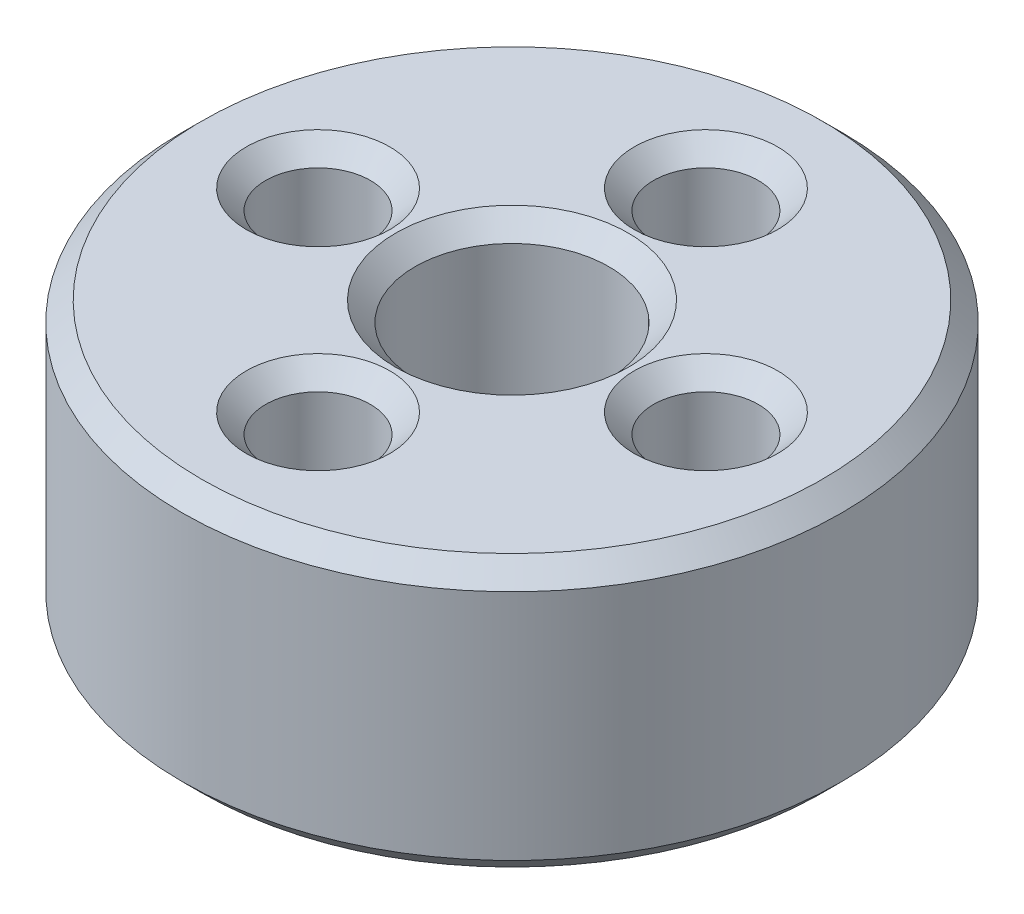
ISO-10303-21;
HEADER;
FILE_DESCRIPTION(('STEP AP214'),'2;1');
FILE_NAME('part.step','',(''),(''),'','','');
FILE_SCHEMA(('AUTOMOTIVE_DESIGN { 1 0 10303 214 1 1 1 1 }'));
ENDSEC;
DATA;
#1=APPLICATION_CONTEXT('core data for automotive mechanical design processes');
#2=APPLICATION_PROTOCOL_DEFINITION('international standard','automotive_design',2000,#1);
#3=PRODUCT_CONTEXT('',#1,'mechanical');
#4=PRODUCT('Part','Part','',(#3));
#5=PRODUCT_RELATED_PRODUCT_CATEGORY('part','',(#4));
#6=PRODUCT_DEFINITION_FORMATION('','',#4);
#7=PRODUCT_DEFINITION_CONTEXT('part definition',#1,'design');
#8=PRODUCT_DEFINITION('design','',#6,#7);
#9=PRODUCT_DEFINITION_SHAPE('','',#8);
#10=(LENGTH_UNIT() NAMED_UNIT(*) SI_UNIT(.MILLI.,.METRE.));
#11=(NAMED_UNIT(*) PLANE_ANGLE_UNIT() SI_UNIT($,.RADIAN.));
#12=(NAMED_UNIT(*) SI_UNIT($,.STERADIAN.) SOLID_ANGLE_UNIT());
#13=UNCERTAINTY_MEASURE_WITH_UNIT(LENGTH_MEASURE(1.E-05),#10,'distance_accuracy_value','');
#14=(GEOMETRIC_REPRESENTATION_CONTEXT(3) GLOBAL_UNCERTAINTY_ASSIGNED_CONTEXT((#13)) GLOBAL_UNIT_ASSIGNED_CONTEXT((#10,
#11,#12)) REPRESENTATION_CONTEXT('',''));
#15=CARTESIAN_POINT('',(0.,0.,0.));
#16=DIRECTION('',(0.,0.,1.));
#17=DIRECTION('',(1.,0.,0.));
#18=AXIS2_PLACEMENT_3D('',#15,#16,#17);
#19=CARTESIAN_POINT('',(0.,7.,0.));
#20=DIRECTION('',(0.,1.,0.));
#21=DIRECTION('',(0.,0.,1.));
#22=AXIS2_PLACEMENT_3D('',#19,#20,#21);
#23=PLANE('',#22);
#24=CARTESIAN_POINT('',(0.,7.,5.));
#25=DIRECTION('',(0.,1.,0.));
#26=DIRECTION('',(0.,0.,1.));
#27=AXIS2_PLACEMENT_3D('',#24,#25,#26);
#28=CIRCLE('',#27,1.85);
#29=CARTESIAN_POINT('',(0.,7.,6.85));
#30=VERTEX_POINT('',#29);
#31=EDGE_CURVE('E10',#30,#30,#28,.F.);
#32=ORIENTED_EDGE('',*,*,#31,.T.);
#33=EDGE_LOOP('',(#32));
#34=FACE_BOUND('',#33,.T.);
#35=CARTESIAN_POINT('',(0.,7.,-5.));
#36=DIRECTION('',(0.,1.,0.));
#37=DIRECTION('',(0.,0.,1.));
#38=AXIS2_PLACEMENT_3D('',#35,#36,#37);
#39=CIRCLE('',#38,1.85);
#40=CARTESIAN_POINT('',(0.,7.,-3.15000000000001));
#41=VERTEX_POINT('',#40);
#42=EDGE_CURVE('E43',#41,#41,#39,.F.);
#43=ORIENTED_EDGE('',*,*,#42,.T.);
#44=EDGE_LOOP('',(#43));
#45=FACE_BOUND('',#44,.T.);
#46=CARTESIAN_POINT('',(-5.,7.,0.));
#47=DIRECTION('',(0.,1.,0.));
#48=DIRECTION('',(0.,0.,1.));
#49=AXIS2_PLACEMENT_3D('',#46,#47,#48);
#50=CIRCLE('',#49,1.85);
#51=CARTESIAN_POINT('',(-5.,7.,1.85));
#52=VERTEX_POINT('',#51);
#53=EDGE_CURVE('E47',#52,#52,#50,.F.);
#54=ORIENTED_EDGE('',*,*,#53,.T.);
#55=EDGE_LOOP('',(#54));
#56=FACE_BOUND('',#55,.T.);
#57=CARTESIAN_POINT('',(0.,7.,0.));
#58=DIRECTION('',(0.,1.,0.));
#59=DIRECTION('',(0.,0.,1.));
#60=AXIS2_PLACEMENT_3D('',#57,#58,#59);
#61=CIRCLE('',#60,7.99999999999999);
#62=CARTESIAN_POINT('',(0.,7.,7.99999999999999));
#63=VERTEX_POINT('',#62);
#64=EDGE_CURVE('E51',#63,#63,#61,.T.);
#65=ORIENTED_EDGE('',*,*,#64,.T.);
#66=EDGE_LOOP('',(#65));
#67=FACE_BOUND('',#66,.T.);
#68=CARTESIAN_POINT('',(0.,7.,0.));
#69=DIRECTION('',(0.,1.,0.));
#70=DIRECTION('',(0.,0.,1.));
#71=AXIS2_PLACEMENT_3D('',#68,#69,#70);
#72=CIRCLE('',#71,3.);
#73=CARTESIAN_POINT('',(0.,7.,3.00000000000001));
#74=VERTEX_POINT('',#73);
#75=EDGE_CURVE('E56',#74,#74,#72,.F.);
#76=ORIENTED_EDGE('',*,*,#75,.T.);
#77=EDGE_LOOP('',(#76));
#78=FACE_BOUND('',#77,.T.);
#79=CARTESIAN_POINT('',(5.,7.,0.));
#80=DIRECTION('',(0.,1.,0.));
#81=DIRECTION('',(0.,0.,1.));
#82=AXIS2_PLACEMENT_3D('',#79,#80,#81);
#83=CIRCLE('',#82,1.85);
#84=CARTESIAN_POINT('',(5.,7.,1.85));
#85=VERTEX_POINT('',#84);
#86=EDGE_CURVE('E59',#85,#85,#83,.F.);
#87=ORIENTED_EDGE('',*,*,#86,.T.);
#88=EDGE_LOOP('',(#87));
#89=FACE_BOUND('',#88,.T.);
#90=ADVANCED_FACE('F35',(#34,#45,#56,#67,#78,#89),#23,.T.);
#91=CARTESIAN_POINT('',(0.,0.,0.));
#92=DIRECTION('',(0.,1.,0.));
#93=DIRECTION('',(0.,0.,1.));
#94=AXIS2_PLACEMENT_3D('',#91,#92,#93);
#95=PLANE('',#94);
#96=CARTESIAN_POINT('',(0.,0.,5.));
#97=DIRECTION('',(0.,1.,0.));
#98=DIRECTION('',(0.,0.,1.));
#99=AXIS2_PLACEMENT_3D('',#96,#97,#98);
#100=CIRCLE('',#99,1.85);
#101=CARTESIAN_POINT('',(0.,0.,6.85));
#102=VERTEX_POINT('',#101);
#103=EDGE_CURVE('E98',#102,#102,#100,.T.);
#104=ORIENTED_EDGE('',*,*,#103,.T.);
#105=EDGE_LOOP('',(#104));
#106=FACE_BOUND('',#105,.T.);
#107=CARTESIAN_POINT('',(5.,0.,0.));
#108=DIRECTION('',(0.,1.,0.));
#109=DIRECTION('',(0.,0.,1.));
#110=AXIS2_PLACEMENT_3D('',#107,#108,#109);
#111=CIRCLE('',#110,1.85);
#112=CARTESIAN_POINT('',(5.,0.,1.85));
#113=VERTEX_POINT('',#112);
#114=EDGE_CURVE('E101',#113,#113,#111,.T.);
#115=ORIENTED_EDGE('',*,*,#114,.T.);
#116=EDGE_LOOP('',(#115));
#117=FACE_BOUND('',#116,.T.);
#118=CARTESIAN_POINT('',(0.,0.,-5.));
#119=DIRECTION('',(0.,1.,0.));
#120=DIRECTION('',(0.,0.,1.));
#121=AXIS2_PLACEMENT_3D('',#118,#119,#120);
#122=CIRCLE('',#121,1.85);
#123=CARTESIAN_POINT('',(0.,0.,-3.15000000000001));
#124=VERTEX_POINT('',#123);
#125=EDGE_CURVE('E104',#124,#124,#122,.T.);
#126=ORIENTED_EDGE('',*,*,#125,.T.);
#127=EDGE_LOOP('',(#126));
#128=FACE_BOUND('',#127,.T.);
#129=CARTESIAN_POINT('',(0.,0.,0.));
#130=DIRECTION('',(0.,1.,0.));
#131=DIRECTION('',(0.,0.,1.));
#132=AXIS2_PLACEMENT_3D('',#129,#130,#131);
#133=CIRCLE('',#132,3.);
#134=CARTESIAN_POINT('',(0.,0.,3.00000000000001));
#135=VERTEX_POINT('',#134);
#136=EDGE_CURVE('E107',#135,#135,#133,.T.);
#137=ORIENTED_EDGE('',*,*,#136,.T.);
#138=EDGE_LOOP('',(#137));
#139=FACE_BOUND('',#138,.T.);
#140=CARTESIAN_POINT('',(-5.,0.,0.));
#141=DIRECTION('',(0.,1.,0.));
#142=DIRECTION('',(0.,0.,1.));
#143=AXIS2_PLACEMENT_3D('',#140,#141,#142);
#144=CIRCLE('',#143,1.85);
#145=CARTESIAN_POINT('',(-5.,0.,1.85));
#146=VERTEX_POINT('',#145);
#147=EDGE_CURVE('E110',#146,#146,#144,.T.);
#148=ORIENTED_EDGE('',*,*,#147,.T.);
#149=EDGE_LOOP('',(#148));
#150=FACE_BOUND('',#149,.T.);
#151=CARTESIAN_POINT('',(0.,0.,0.));
#152=DIRECTION('',(0.,1.,0.));
#153=DIRECTION('',(0.,0.,1.));
#154=AXIS2_PLACEMENT_3D('',#151,#152,#153);
#155=CIRCLE('',#154,8.);
#156=CARTESIAN_POINT('',(0.,0.,8.));
#157=VERTEX_POINT('',#156);
#158=EDGE_CURVE('E113',#157,#157,#155,.F.);
#159=ORIENTED_EDGE('',*,*,#158,.T.);
#160=EDGE_LOOP('',(#159));
#161=FACE_BOUND('',#160,.T.);
#162=ADVANCED_FACE('F117',(#106,#117,#128,#139,#150,#161),#95,.F.);
#163=CARTESIAN_POINT('',(0.,7.,0.));
#164=DIRECTION('',(0.,-1.,0.));
#165=DIRECTION('',(0.,0.,-1.));
#166=AXIS2_PLACEMENT_3D('',#163,#164,#165);
#167=CYLINDRICAL_SURFACE('',#166,8.5);
#168=CARTESIAN_POINT('',(0.,0.500000000000002,0.));
#169=DIRECTION('',(0.,1.,0.));
#170=DIRECTION('',(0.,0.,1.));
#171=AXIS2_PLACEMENT_3D('',#168,#169,#170);
#172=CIRCLE('',#171,8.5);
#173=CARTESIAN_POINT('',(0.,0.500000000000002,8.5));
#174=VERTEX_POINT('',#173);
#175=EDGE_CURVE('E62',#174,#174,#172,.T.);
#176=ORIENTED_EDGE('',*,*,#175,.T.);
#177=EDGE_LOOP('',(#176));
#178=FACE_BOUND('',#177,.T.);
#179=CARTESIAN_POINT('',(0.,6.49999999999999,0.));
#180=DIRECTION('',(0.,1.,0.));
#181=DIRECTION('',(0.,0.,1.));
#182=AXIS2_PLACEMENT_3D('',#179,#180,#181);
#183=CIRCLE('',#182,8.5);
#184=CARTESIAN_POINT('',(0.,6.49999999999999,8.5));
#185=VERTEX_POINT('',#184);
#186=EDGE_CURVE('E65',#185,#185,#183,.F.);
#187=ORIENTED_EDGE('',*,*,#186,.T.);
#188=EDGE_LOOP('',(#187));
#189=FACE_BOUND('',#188,.T.);
#190=ADVANCED_FACE('F127',(#178,#189),#167,.T.);
#191=CARTESIAN_POINT('',(-5.,7.,0.));
#192=DIRECTION('',(0.,-1.,0.));
#193=DIRECTION('',(0.,0.,-1.));
#194=AXIS2_PLACEMENT_3D('',#191,#192,#193);
#195=CYLINDRICAL_SURFACE('',#194,1.35);
#196=CARTESIAN_POINT('',(-5.,0.500000000000006,0.));
#197=DIRECTION('',(0.,1.,0.));
#198=DIRECTION('',(0.,0.,1.));
#199=AXIS2_PLACEMENT_3D('',#196,#197,#198);
#200=CIRCLE('',#199,1.35);
#201=CARTESIAN_POINT('',(-5.,0.500000000000006,1.35));
#202=VERTEX_POINT('',#201);
#203=EDGE_CURVE('E68',#202,#202,#200,.F.);
#204=ORIENTED_EDGE('',*,*,#203,.T.);
#205=EDGE_LOOP('',(#204));
#206=FACE_BOUND('',#205,.T.);
#207=CARTESIAN_POINT('',(-5.,6.5,0.));
#208=DIRECTION('',(0.,1.,0.));
#209=DIRECTION('',(0.,0.,1.));
#210=AXIS2_PLACEMENT_3D('',#207,#208,#209);
#211=CIRCLE('',#210,1.35);
#212=CARTESIAN_POINT('',(-5.,6.5,1.35));
#213=VERTEX_POINT('',#212);
#214=EDGE_CURVE('E71',#213,#213,#211,.T.);
#215=ORIENTED_EDGE('',*,*,#214,.T.);
#216=EDGE_LOOP('',(#215));
#217=FACE_BOUND('',#216,.T.);
#218=ADVANCED_FACE('F130',(#206,#217),#195,.F.);
#219=CARTESIAN_POINT('',(0.,7.,0.));
#220=DIRECTION('',(0.,-1.,0.));
#221=DIRECTION('',(0.,0.,-1.));
#222=AXIS2_PLACEMENT_3D('',#219,#220,#221);
#223=CYLINDRICAL_SURFACE('',#222,2.5);
#224=CARTESIAN_POINT('',(0.,0.500000000000001,0.));
#225=DIRECTION('',(0.,1.,0.));
#226=DIRECTION('',(0.,0.,1.));
#227=AXIS2_PLACEMENT_3D('',#224,#225,#226);
#228=CIRCLE('',#227,2.5);
#229=CARTESIAN_POINT('',(0.,0.500000000000001,2.50000000000001));
#230=VERTEX_POINT('',#229);
#231=EDGE_CURVE('E74',#230,#230,#228,.F.);
#232=ORIENTED_EDGE('',*,*,#231,.T.);
#233=EDGE_LOOP('',(#232));
#234=FACE_BOUND('',#233,.T.);
#235=CARTESIAN_POINT('',(0.,6.5,0.));
#236=DIRECTION('',(0.,1.,0.));
#237=DIRECTION('',(0.,0.,1.));
#238=AXIS2_PLACEMENT_3D('',#235,#236,#237);
#239=CIRCLE('',#238,2.5);
#240=CARTESIAN_POINT('',(0.,6.5,2.50000000000001));
#241=VERTEX_POINT('',#240);
#242=EDGE_CURVE('E77',#241,#241,#239,.T.);
#243=ORIENTED_EDGE('',*,*,#242,.T.);
#244=EDGE_LOOP('',(#243));
#245=FACE_BOUND('',#244,.T.);
#246=ADVANCED_FACE('F166',(#234,#245),#223,.F.);
#247=CARTESIAN_POINT('',(0.,7.,-5.));
#248=DIRECTION('',(0.,-1.,0.));
#249=DIRECTION('',(0.,0.,-1.));
#250=AXIS2_PLACEMENT_3D('',#247,#248,#249);
#251=CYLINDRICAL_SURFACE('',#250,1.35);
#252=CARTESIAN_POINT('',(0.,0.500000000000004,-5.));
#253=DIRECTION('',(0.,1.,0.));
#254=DIRECTION('',(0.,0.,1.));
#255=AXIS2_PLACEMENT_3D('',#252,#253,#254);
#256=CIRCLE('',#255,1.35);
#257=CARTESIAN_POINT('',(0.,0.500000000000004,-3.65000000000001));
#258=VERTEX_POINT('',#257);
#259=EDGE_CURVE('E80',#258,#258,#256,.F.);
#260=ORIENTED_EDGE('',*,*,#259,.T.);
#261=EDGE_LOOP('',(#260));
#262=FACE_BOUND('',#261,.T.);
#263=CARTESIAN_POINT('',(0.,6.5,-5.));
#264=DIRECTION('',(0.,1.,0.));
#265=DIRECTION('',(0.,0.,1.));
#266=AXIS2_PLACEMENT_3D('',#263,#264,#265);
#267=CIRCLE('',#266,1.35);
#268=CARTESIAN_POINT('',(0.,6.5,-3.65000000000001));
#269=VERTEX_POINT('',#268);
#270=EDGE_CURVE('E83',#269,#269,#267,.T.);
#271=ORIENTED_EDGE('',*,*,#270,.T.);
#272=EDGE_LOOP('',(#271));
#273=FACE_BOUND('',#272,.T.);
#274=ADVANCED_FACE('F156',(#262,#273),#251,.F.);
#275=CARTESIAN_POINT('',(5.,7.,0.));
#276=DIRECTION('',(0.,-1.,0.));
#277=DIRECTION('',(0.,0.,-1.));
#278=AXIS2_PLACEMENT_3D('',#275,#276,#277);
#279=CYLINDRICAL_SURFACE('',#278,1.35);
#280=CARTESIAN_POINT('',(5.,0.5,0.));
#281=DIRECTION('',(0.,1.,0.));
#282=DIRECTION('',(0.,0.,1.));
#283=AXIS2_PLACEMENT_3D('',#280,#281,#282);
#284=CIRCLE('',#283,1.35);
#285=CARTESIAN_POINT('',(5.,0.5,1.35));
#286=VERTEX_POINT('',#285);
#287=EDGE_CURVE('E86',#286,#286,#284,.F.);
#288=ORIENTED_EDGE('',*,*,#287,.T.);
#289=EDGE_LOOP('',(#288));
#290=FACE_BOUND('',#289,.T.);
#291=CARTESIAN_POINT('',(5.,6.5,0.));
#292=DIRECTION('',(0.,1.,0.));
#293=DIRECTION('',(0.,0.,1.));
#294=AXIS2_PLACEMENT_3D('',#291,#292,#293);
#295=CIRCLE('',#294,1.35);
#296=CARTESIAN_POINT('',(5.,6.5,1.35));
#297=VERTEX_POINT('',#296);
#298=EDGE_CURVE('E89',#297,#297,#295,.T.);
#299=ORIENTED_EDGE('',*,*,#298,.T.);
#300=EDGE_LOOP('',(#299));
#301=FACE_BOUND('',#300,.T.);
#302=ADVANCED_FACE('F153',(#290,#301),#279,.F.);
#303=CARTESIAN_POINT('',(0.,7.,5.));
#304=DIRECTION('',(0.,-1.,0.));
#305=DIRECTION('',(0.,0.,-1.));
#306=AXIS2_PLACEMENT_3D('',#303,#304,#305);
#307=CYLINDRICAL_SURFACE('',#306,1.35);
#308=CARTESIAN_POINT('',(0.,0.500000000000006,5.));
#309=DIRECTION('',(0.,1.,0.));
#310=DIRECTION('',(0.,0.,1.));
#311=AXIS2_PLACEMENT_3D('',#308,#309,#310);
#312=CIRCLE('',#311,1.35);
#313=CARTESIAN_POINT('',(0.,0.500000000000006,6.35));
#314=VERTEX_POINT('',#313);
#315=EDGE_CURVE('E92',#314,#314,#312,.F.);
#316=ORIENTED_EDGE('',*,*,#315,.T.);
#317=EDGE_LOOP('',(#316));
#318=FACE_BOUND('',#317,.T.);
#319=CARTESIAN_POINT('',(0.,6.5,5.));
#320=DIRECTION('',(0.,1.,0.));
#321=DIRECTION('',(0.,0.,1.));
#322=AXIS2_PLACEMENT_3D('',#319,#320,#321);
#323=CIRCLE('',#322,1.35);
#324=CARTESIAN_POINT('',(0.,6.5,6.35));
#325=VERTEX_POINT('',#324);
#326=EDGE_CURVE('E95',#325,#325,#323,.T.);
#327=ORIENTED_EDGE('',*,*,#326,.T.);
#328=EDGE_LOOP('',(#327));
#329=FACE_BOUND('',#328,.T.);
#330=ADVANCED_FACE('F155',(#318,#329),#307,.F.);
#331=CARTESIAN_POINT('',(0.,0.,5.));
#332=DIRECTION('',(0.,-1.,0.));
#333=DIRECTION('',(0.,0.,-1.));
#334=AXIS2_PLACEMENT_3D('',#331,#332,#333);
#335=CONICAL_SURFACE('',#334,1.85,0.785398163397446);
#336=ORIENTED_EDGE('',*,*,#315,.F.);
#337=EDGE_LOOP('',(#336));
#338=FACE_BOUND('',#337,.T.);
#339=ORIENTED_EDGE('',*,*,#103,.F.);
#340=EDGE_LOOP('',(#339));
#341=FACE_BOUND('',#340,.T.);
#342=ADVANCED_FACE('F163',(#338,#341),#335,.F.);
#343=CARTESIAN_POINT('',(5.,0.,0.));
#344=DIRECTION('',(0.,-1.,0.));
#345=DIRECTION('',(0.,0.,-1.));
#346=AXIS2_PLACEMENT_3D('',#343,#344,#345);
#347=CONICAL_SURFACE('',#346,1.85,0.785398163397446);
#348=ORIENTED_EDGE('',*,*,#287,.F.);
#349=EDGE_LOOP('',(#348));
#350=FACE_BOUND('',#349,.T.);
#351=ORIENTED_EDGE('',*,*,#114,.F.);
#352=EDGE_LOOP('',(#351));
#353=FACE_BOUND('',#352,.T.);
#354=ADVANCED_FACE('F185',(#350,#353),#347,.F.);
#355=CARTESIAN_POINT('',(0.,0.,-5.));
#356=DIRECTION('',(0.,-1.,0.));
#357=DIRECTION('',(0.,0.,-1.));
#358=AXIS2_PLACEMENT_3D('',#355,#356,#357);
#359=CONICAL_SURFACE('',#358,1.85,0.785398163397446);
#360=ORIENTED_EDGE('',*,*,#259,.F.);
#361=EDGE_LOOP('',(#360));
#362=FACE_BOUND('',#361,.T.);
#363=ORIENTED_EDGE('',*,*,#125,.F.);
#364=EDGE_LOOP('',(#363));
#365=FACE_BOUND('',#364,.T.);
#366=ADVANCED_FACE('F192',(#362,#365),#359,.F.);
#367=CARTESIAN_POINT('',(0.,0.,0.));
#368=DIRECTION('',(0.,-1.,0.));
#369=DIRECTION('',(0.,0.,-1.));
#370=AXIS2_PLACEMENT_3D('',#367,#368,#369);
#371=CONICAL_SURFACE('',#370,3.,0.785398163397447);
#372=ORIENTED_EDGE('',*,*,#231,.F.);
#373=EDGE_LOOP('',(#372));
#374=FACE_BOUND('',#373,.T.);
#375=ORIENTED_EDGE('',*,*,#136,.F.);
#376=EDGE_LOOP('',(#375));
#377=FACE_BOUND('',#376,.T.);
#378=ADVANCED_FACE('F199',(#374,#377),#371,.F.);
#379=CARTESIAN_POINT('',(-5.,0.,0.));
#380=DIRECTION('',(0.,-1.,0.));
#381=DIRECTION('',(0.,0.,-1.));
#382=AXIS2_PLACEMENT_3D('',#379,#380,#381);
#383=CONICAL_SURFACE('',#382,1.85,0.785398163397446);
#384=ORIENTED_EDGE('',*,*,#203,.F.);
#385=EDGE_LOOP('',(#384));
#386=FACE_BOUND('',#385,.T.);
#387=ORIENTED_EDGE('',*,*,#147,.F.);
#388=EDGE_LOOP('',(#387));
#389=FACE_BOUND('',#388,.T.);
#390=ADVANCED_FACE('F123',(#386,#389),#383,.F.);
#391=CARTESIAN_POINT('',(0.,0.500000000000002,0.));
#392=DIRECTION('',(0.,1.,0.));
#393=DIRECTION('',(0.,0.,1.));
#394=AXIS2_PLACEMENT_3D('',#391,#392,#393);
#395=CONICAL_SURFACE('',#394,8.5,0.785398163397448);
#396=ORIENTED_EDGE('',*,*,#158,.F.);
#397=EDGE_LOOP('',(#396));
#398=FACE_BOUND('',#397,.T.);
#399=ORIENTED_EDGE('',*,*,#175,.F.);
#400=EDGE_LOOP('',(#399));
#401=FACE_BOUND('',#400,.T.);
#402=ADVANCED_FACE('F119',(#398,#401),#395,.T.);
#403=CARTESIAN_POINT('',(0.,6.5,5.));
#404=DIRECTION('',(0.,1.,0.));
#405=DIRECTION('',(0.,0.,1.));
#406=AXIS2_PLACEMENT_3D('',#403,#404,#405);
#407=CONICAL_SURFACE('',#406,1.35,0.785398163397451);
#408=ORIENTED_EDGE('',*,*,#31,.F.);
#409=EDGE_LOOP('',(#408));
#410=FACE_BOUND('',#409,.T.);
#411=ORIENTED_EDGE('',*,*,#326,.F.);
#412=EDGE_LOOP('',(#411));
#413=FACE_BOUND('',#412,.T.);
#414=ADVANCED_FACE('F122',(#410,#413),#407,.F.);
#415=CARTESIAN_POINT('',(0.,6.5,-5.));
#416=DIRECTION('',(0.,1.,0.));
#417=DIRECTION('',(0.,0.,1.));
#418=AXIS2_PLACEMENT_3D('',#415,#416,#417);
#419=CONICAL_SURFACE('',#418,1.35,0.785398163397447);
#420=ORIENTED_EDGE('',*,*,#42,.F.);
#421=EDGE_LOOP('',(#420));
#422=FACE_BOUND('',#421,.T.);
#423=ORIENTED_EDGE('',*,*,#270,.F.);
#424=EDGE_LOOP('',(#423));
#425=FACE_BOUND('',#424,.T.);
#426=ADVANCED_FACE('F221',(#422,#425),#419,.F.);
#427=CARTESIAN_POINT('',(-5.,6.5,0.));
#428=DIRECTION('',(0.,1.,0.));
#429=DIRECTION('',(0.,0.,1.));
#430=AXIS2_PLACEMENT_3D('',#427,#428,#429);
#431=CONICAL_SURFACE('',#430,1.35,0.785398163397451);
#432=ORIENTED_EDGE('',*,*,#53,.F.);
#433=EDGE_LOOP('',(#432));
#434=FACE_BOUND('',#433,.T.);
#435=ORIENTED_EDGE('',*,*,#214,.F.);
#436=EDGE_LOOP('',(#435));
#437=FACE_BOUND('',#436,.T.);
#438=ADVANCED_FACE('F138',(#434,#437),#431,.F.);
#439=CARTESIAN_POINT('',(0.,7.,0.));
#440=DIRECTION('',(0.,-1.,0.));
#441=DIRECTION('',(0.,0.,-1.));
#442=AXIS2_PLACEMENT_3D('',#439,#440,#441);
#443=CONICAL_SURFACE('',#442,7.99999999999999,0.785398163397447);
#444=ORIENTED_EDGE('',*,*,#186,.F.);
#445=EDGE_LOOP('',(#444));
#446=FACE_BOUND('',#445,.T.);
#447=ORIENTED_EDGE('',*,*,#64,.F.);
#448=EDGE_LOOP('',(#447));
#449=FACE_BOUND('',#448,.T.);
#450=ADVANCED_FACE('F134',(#446,#449),#443,.T.);
#451=CARTESIAN_POINT('',(0.,6.5,0.));
#452=DIRECTION('',(0.,1.,0.));
#453=DIRECTION('',(0.,0.,1.));
#454=AXIS2_PLACEMENT_3D('',#451,#452,#453);
#455=CONICAL_SURFACE('',#454,2.5,0.785398163397447);
#456=ORIENTED_EDGE('',*,*,#75,.F.);
#457=EDGE_LOOP('',(#456));
#458=FACE_BOUND('',#457,.T.);
#459=ORIENTED_EDGE('',*,*,#242,.F.);
#460=EDGE_LOOP('',(#459));
#461=FACE_BOUND('',#460,.T.);
#462=ADVANCED_FACE('F137',(#458,#461),#455,.F.);
#463=CARTESIAN_POINT('',(5.,6.5,0.));
#464=DIRECTION('',(0.,1.,0.));
#465=DIRECTION('',(0.,0.,1.));
#466=AXIS2_PLACEMENT_3D('',#463,#464,#465);
#467=CONICAL_SURFACE('',#466,1.35,0.785398163397451);
#468=ORIENTED_EDGE('',*,*,#86,.F.);
#469=EDGE_LOOP('',(#468));
#470=FACE_BOUND('',#469,.T.);
#471=ORIENTED_EDGE('',*,*,#298,.F.);
#472=EDGE_LOOP('',(#471));
#473=FACE_BOUND('',#472,.T.);
#474=ADVANCED_FACE('F38',(#470,#473),#467,.F.);
#475=CLOSED_SHELL('',(#90,#162,#190,#218,#246,#274,#302,#330,#342,#354,#366,#378,#390,#402,#414,
#426,#438,#450,#462,#474));
#476=MANIFOLD_SOLID_BREP('B2',#475);
#477=ADVANCED_BREP_SHAPE_REPRESENTATION('',(#18,#476),#14);
#478=SHAPE_DEFINITION_REPRESENTATION(#9,#477);
ENDSEC;
END-ISO-10303-21;
